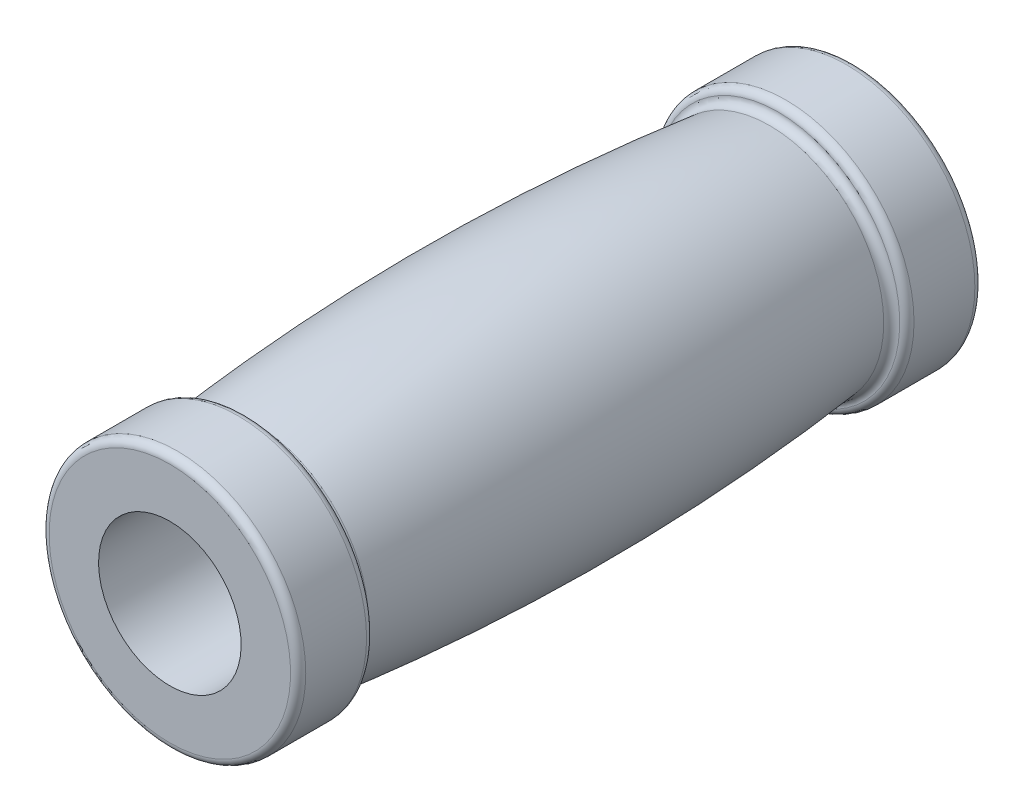
ISO-10303-21;
HEADER;
FILE_DESCRIPTION(('STEP AP214'),'2;1');
FILE_NAME('part.step','',(''),(''),'','','');
FILE_SCHEMA(('AUTOMOTIVE_DESIGN { 1 0 10303 214 1 1 1 1 }'));
ENDSEC;
DATA;
#1=APPLICATION_CONTEXT('core data for automotive mechanical design processes');
#2=APPLICATION_PROTOCOL_DEFINITION('international standard','automotive_design',2000,#1);
#3=PRODUCT_CONTEXT('',#1,'mechanical');
#4=PRODUCT('Part','Part','',(#3));
#5=PRODUCT_RELATED_PRODUCT_CATEGORY('part','',(#4));
#6=PRODUCT_DEFINITION_FORMATION('','',#4);
#7=PRODUCT_DEFINITION_CONTEXT('part definition',#1,'design');
#8=PRODUCT_DEFINITION('design','',#6,#7);
#9=PRODUCT_DEFINITION_SHAPE('','',#8);
#10=(LENGTH_UNIT() NAMED_UNIT(*) SI_UNIT(.MILLI.,.METRE.));
#11=(NAMED_UNIT(*) PLANE_ANGLE_UNIT() SI_UNIT($,.RADIAN.));
#12=(NAMED_UNIT(*) SI_UNIT($,.STERADIAN.) SOLID_ANGLE_UNIT());
#13=UNCERTAINTY_MEASURE_WITH_UNIT(LENGTH_MEASURE(1.E-05),#10,'distance_accuracy_value','');
#14=(GEOMETRIC_REPRESENTATION_CONTEXT(3) GLOBAL_UNCERTAINTY_ASSIGNED_CONTEXT((#13)) GLOBAL_UNIT_ASSIGNED_CONTEXT((#10,
#11,#12)) REPRESENTATION_CONTEXT('',''));
#15=CARTESIAN_POINT('',(0.,0.,0.));
#16=DIRECTION('',(0.,0.,1.));
#17=DIRECTION('',(1.,0.,0.));
#18=AXIS2_PLACEMENT_3D('',#15,#16,#17);
#19=CARTESIAN_POINT('',(0.,20.1612500000029,-57.15));
#20=DIRECTION('',(0.,0.,-1.));
#21=DIRECTION('',(0.,1.,0.));
#22=AXIS2_PLACEMENT_3D('',#19,#20,#21);
#23=PLANE('',#22);
#24=CARTESIAN_POINT('',(0.,0.,-57.1499999999967));
#25=DIRECTION('',(0.,0.,-1.));
#26=DIRECTION('',(0.,1.,0.));
#27=AXIS2_PLACEMENT_3D('',#24,#25,#26);
#28=CIRCLE('',#27,20.1612500000028);
#29=CARTESIAN_POINT('',(0.,20.1612500000029,-57.1499999999967));
#30=VERTEX_POINT('',#29);
#31=EDGE_CURVE('E10',#30,#30,#28,.T.);
#32=ORIENTED_EDGE('',*,*,#31,.T.);
#33=EDGE_LOOP('',(#32));
#34=FACE_BOUND('',#33,.T.);
#35=CARTESIAN_POINT('',(0.,0.,-57.1500000000033));
#36=DIRECTION('',(0.,0.,-1.));
#37=DIRECTION('',(0.,1.,0.));
#38=AXIS2_PLACEMENT_3D('',#35,#36,#37);
#39=CIRCLE('',#38,11.9062499999999);
#40=CARTESIAN_POINT('',(0.,11.90625,-57.1500000000033));
#41=VERTEX_POINT('',#40);
#42=EDGE_CURVE('E76',#41,#41,#39,.T.);
#43=ORIENTED_EDGE('',*,*,#42,.F.);
#44=EDGE_LOOP('',(#43));
#45=FACE_BOUND('',#44,.T.);
#46=ADVANCED_FACE('F30',(#34,#45),#23,.T.);
#47=CARTESIAN_POINT('',(0.,0.,-55.8799999999967));
#48=DIRECTION('',(0.,0.,-1.));
#49=DIRECTION('',(0.,1.,0.));
#50=AXIS2_PLACEMENT_3D('',#47,#48,#49);
#51=TOROIDAL_SURFACE('',#50,20.1612500000028,1.27);
#52=CARTESIAN_POINT('',(0.,0.,-55.8799999999967));
#53=DIRECTION('',(0.,0.,-1.));
#54=DIRECTION('',(0.,1.,0.));
#55=AXIS2_PLACEMENT_3D('',#52,#53,#54);
#56=CIRCLE('',#55,21.4312500000028);
#57=CARTESIAN_POINT('',(0.,21.4312500000029,-55.8799999999967));
#58=VERTEX_POINT('',#57);
#59=EDGE_CURVE('E36',#58,#58,#56,.T.);
#60=ORIENTED_EDGE('',*,*,#59,.T.);
#61=EDGE_LOOP('',(#60));
#62=FACE_BOUND('',#61,.T.);
#63=ORIENTED_EDGE('',*,*,#31,.F.);
#64=EDGE_LOOP('',(#63));
#65=FACE_BOUND('',#64,.T.);
#66=ADVANCED_FACE('F84',(#62,#65),#51,.T.);
#67=CARTESIAN_POINT('',(0.,0.,-57.1500000000033));
#68=DIRECTION('',(0.,0.,-1.));
#69=DIRECTION('',(0.,1.,0.));
#70=AXIS2_PLACEMENT_3D('',#67,#68,#69);
#71=CYLINDRICAL_SURFACE('',#70,21.4312500000014);
#72=CARTESIAN_POINT('',(0.,0.,-45.7199999999968));
#73=DIRECTION('',(0.,0.,-1.));
#74=DIRECTION('',(0.,1.,0.));
#75=AXIS2_PLACEMENT_3D('',#72,#73,#74);
#76=CIRCLE('',#75,21.4312499999999);
#77=CARTESIAN_POINT('',(0.,21.43125,-45.7199999999968));
#78=VERTEX_POINT('',#77);
#79=EDGE_CURVE('E40',#78,#78,#76,.T.);
#80=ORIENTED_EDGE('',*,*,#79,.T.);
#81=EDGE_LOOP('',(#80));
#82=FACE_BOUND('',#81,.T.);
#83=ORIENTED_EDGE('',*,*,#59,.F.);
#84=EDGE_LOOP('',(#83));
#85=FACE_BOUND('',#84,.T.);
#86=ADVANCED_FACE('F88',(#82,#85),#71,.T.);
#87=CARTESIAN_POINT('',(0.,0.,-45.7199999999968));
#88=DIRECTION('',(0.,0.,-1.));
#89=DIRECTION('',(0.,1.,0.));
#90=AXIS2_PLACEMENT_3D('',#87,#88,#89);
#91=TOROIDAL_SURFACE('',#90,20.1612499999999,1.27000000000006);
#92=CARTESIAN_POINT('',(0.,0.,-44.4499999999967));
#93=DIRECTION('',(0.,0.,-1.));
#94=DIRECTION('',(0.,1.,0.));
#95=AXIS2_PLACEMENT_3D('',#92,#93,#94);
#96=CIRCLE('',#95,20.1612499999999);
#97=CARTESIAN_POINT('',(0.,20.1612499999999,-44.4499999999967));
#98=VERTEX_POINT('',#97);
#99=EDGE_CURVE('E44',#98,#98,#96,.T.);
#100=ORIENTED_EDGE('',*,*,#99,.T.);
#101=EDGE_LOOP('',(#100));
#102=FACE_BOUND('',#101,.T.);
#103=ORIENTED_EDGE('',*,*,#79,.F.);
#104=EDGE_LOOP('',(#103));
#105=FACE_BOUND('',#104,.T.);
#106=ADVANCED_FACE('F92',(#102,#105),#91,.T.);
#107=CARTESIAN_POINT('',(0.,20.1612499999999,-44.4499999999967));
#108=DIRECTION('',(0.,0.,-1.));
#109=DIRECTION('',(0.,1.,0.));
#110=AXIS2_PLACEMENT_3D('',#107,#108,#109);
#111=PLANE('',#110);
#112=CARTESIAN_POINT('',(0.,0.,-44.4499999999967));
#113=DIRECTION('',(0.,0.,-1.));
#114=DIRECTION('',(0.,1.,0.));
#115=AXIS2_PLACEMENT_3D('',#112,#113,#114);
#116=CIRCLE('',#115,20.3122487124073);
#117=CARTESIAN_POINT('',(0.,20.3122487124074,-44.4499999999967));
#118=VERTEX_POINT('',#117);
#119=EDGE_CURVE('E49',#118,#118,#116,.T.);
#120=ORIENTED_EDGE('',*,*,#119,.T.);
#121=EDGE_LOOP('',(#120));
#122=FACE_BOUND('',#121,.T.);
#123=ORIENTED_EDGE('',*,*,#99,.F.);
#124=EDGE_LOOP('',(#123));
#125=FACE_BOUND('',#124,.T.);
#126=ADVANCED_FACE('F99',(#122,#125),#111,.T.);
#127=CARTESIAN_POINT('',(0.,0.,-43.1799999999967));
#128=DIRECTION('',(0.,0.,-1.));
#129=DIRECTION('',(0.,1.,0.));
#130=AXIS2_PLACEMENT_3D('',#127,#128,#129);
#131=TOROIDAL_SURFACE('',#130,20.3122487124073,1.27);
#132=CARTESIAN_POINT('',(0.,0.,-43.039899364646));
#133=DIRECTION('',(0.,0.,-1.));
#134=DIRECTION('',(0.,1.,0.));
#135=AXIS2_PLACEMENT_3D('',#132,#133,#134);
#136=CIRCLE('',#135,19.0500000000002);
#137=CARTESIAN_POINT('',(0.,19.0500000000002,-43.039899364646));
#138=VERTEX_POINT('',#137);
#139=EDGE_CURVE('E52',#138,#138,#136,.T.);
#140=ORIENTED_EDGE('',*,*,#139,.T.);
#141=EDGE_LOOP('',(#140));
#142=FACE_BOUND('',#141,.T.);
#143=ORIENTED_EDGE('',*,*,#119,.F.);
#144=EDGE_LOOP('',(#143));
#145=FACE_BOUND('',#144,.T.);
#146=ADVANCED_FACE('F103',(#142,#145),#131,.F.);
#147=CARTESIAN_POINT('',(0.,0.,-2.97306208634878E-12));
#148=DIRECTION('',(0.,0.,-1.));
#149=DIRECTION('',(0.,1.,0.));
#150=AXIS2_PLACEMENT_3D('',#147,#148,#149);
#151=DEGENERATE_TOROIDAL_SURFACE('',#150,368.721671549945,390.152921549944,.F.);
#152=CARTESIAN_POINT('',(0.,0.,43.0398993646459));
#153=DIRECTION('',(0.,0.,-1.));
#154=DIRECTION('',(0.,1.,0.));
#155=AXIS2_PLACEMENT_3D('',#152,#153,#154);
#156=CIRCLE('',#155,19.05);
#157=CARTESIAN_POINT('',(0.,19.0499999999999,43.0398993646459));
#158=VERTEX_POINT('',#157);
#159=EDGE_CURVE('E55',#158,#158,#156,.T.);
#160=ORIENTED_EDGE('',*,*,#159,.T.);
#161=EDGE_LOOP('',(#160));
#162=FACE_BOUND('',#161,.T.);
#163=ORIENTED_EDGE('',*,*,#139,.F.);
#164=EDGE_LOOP('',(#163));
#165=FACE_BOUND('',#164,.T.);
#166=ADVANCED_FACE('F107',(#162,#165),#151,.F.);
#167=CARTESIAN_POINT('',(0.,0.,43.1799999999966));
#168=DIRECTION('',(0.,0.,-1.));
#169=DIRECTION('',(0.,1.,0.));
#170=AXIS2_PLACEMENT_3D('',#167,#168,#169);
#171=TOROIDAL_SURFACE('',#170,20.3122487124074,1.27);
#172=CARTESIAN_POINT('',(0.,0.,44.4499999999966));
#173=DIRECTION('',(0.,0.,-1.));
#174=DIRECTION('',(0.,1.,0.));
#175=AXIS2_PLACEMENT_3D('',#172,#173,#174);
#176=CIRCLE('',#175,20.3122487124074);
#177=CARTESIAN_POINT('',(0.,20.3122487124074,44.4499999999967));
#178=VERTEX_POINT('',#177);
#179=EDGE_CURVE('E58',#178,#178,#176,.T.);
#180=ORIENTED_EDGE('',*,*,#179,.T.);
#181=EDGE_LOOP('',(#180));
#182=FACE_BOUND('',#181,.T.);
#183=ORIENTED_EDGE('',*,*,#159,.F.);
#184=EDGE_LOOP('',(#183));
#185=FACE_BOUND('',#184,.T.);
#186=ADVANCED_FACE('F111',(#182,#185),#171,.F.);
#187=CARTESIAN_POINT('',(0.,20.1612499999999,44.4499999999967));
#188=DIRECTION('',(0.,0.,1.));
#189=DIRECTION('',(0.,-1.,0.));
#190=AXIS2_PLACEMENT_3D('',#187,#188,#189);
#191=PLANE('',#190);
#192=CARTESIAN_POINT('',(0.,0.,44.4499999999967));
#193=DIRECTION('',(0.,0.,-1.));
#194=DIRECTION('',(0.,1.,0.));
#195=AXIS2_PLACEMENT_3D('',#192,#193,#194);
#196=CIRCLE('',#195,20.1612499999999);
#197=CARTESIAN_POINT('',(0.,20.1612499999999,44.4499999999967));
#198=VERTEX_POINT('',#197);
#199=EDGE_CURVE('E61',#198,#198,#196,.T.);
#200=ORIENTED_EDGE('',*,*,#199,.T.);
#201=EDGE_LOOP('',(#200));
#202=FACE_BOUND('',#201,.T.);
#203=ORIENTED_EDGE('',*,*,#179,.F.);
#204=EDGE_LOOP('',(#203));
#205=FACE_BOUND('',#204,.T.);
#206=ADVANCED_FACE('F115',(#202,#205),#191,.T.);
#207=CARTESIAN_POINT('',(0.,0.,45.7199999999968));
#208=DIRECTION('',(0.,0.,-1.));
#209=DIRECTION('',(0.,1.,0.));
#210=AXIS2_PLACEMENT_3D('',#207,#208,#209);
#211=TOROIDAL_SURFACE('',#210,20.1612499999999,1.27000000000006);
#212=CARTESIAN_POINT('',(0.,0.,45.7199999999968));
#213=DIRECTION('',(0.,0.,-1.));
#214=DIRECTION('',(0.,1.,0.));
#215=AXIS2_PLACEMENT_3D('',#212,#213,#214);
#216=CIRCLE('',#215,21.4312499999999);
#217=CARTESIAN_POINT('',(0.,21.4312499999999,45.7199999999968));
#218=VERTEX_POINT('',#217);
#219=EDGE_CURVE('E64',#218,#218,#216,.T.);
#220=ORIENTED_EDGE('',*,*,#219,.T.);
#221=EDGE_LOOP('',(#220));
#222=FACE_BOUND('',#221,.T.);
#223=ORIENTED_EDGE('',*,*,#199,.F.);
#224=EDGE_LOOP('',(#223));
#225=FACE_BOUND('',#224,.T.);
#226=ADVANCED_FACE('F119',(#222,#225),#211,.T.);
#227=CARTESIAN_POINT('',(0.,0.,-57.1500000000033));
#228=DIRECTION('',(0.,0.,-1.));
#229=DIRECTION('',(0.,1.,0.));
#230=AXIS2_PLACEMENT_3D('',#227,#228,#229);
#231=CYLINDRICAL_SURFACE('',#230,21.4312500000014);
#232=CARTESIAN_POINT('',(0.,0.,55.8799999999966));
#233=DIRECTION('',(0.,0.,-1.));
#234=DIRECTION('',(0.,1.,0.));
#235=AXIS2_PLACEMENT_3D('',#232,#233,#234);
#236=CIRCLE('',#235,21.4312500000029);
#237=CARTESIAN_POINT('',(0.,21.4312500000029,55.8799999999966));
#238=VERTEX_POINT('',#237);
#239=EDGE_CURVE('E67',#238,#238,#236,.T.);
#240=ORIENTED_EDGE('',*,*,#239,.T.);
#241=EDGE_LOOP('',(#240));
#242=FACE_BOUND('',#241,.T.);
#243=ORIENTED_EDGE('',*,*,#219,.F.);
#244=EDGE_LOOP('',(#243));
#245=FACE_BOUND('',#244,.T.);
#246=ADVANCED_FACE('F123',(#242,#245),#231,.T.);
#247=CARTESIAN_POINT('',(0.,0.,55.8799999999966));
#248=DIRECTION('',(0.,0.,-1.));
#249=DIRECTION('',(0.,1.,0.));
#250=AXIS2_PLACEMENT_3D('',#247,#248,#249);
#251=TOROIDAL_SURFACE('',#250,20.1612500000029,1.27);
#252=CARTESIAN_POINT('',(0.,0.,57.1499999999967));
#253=DIRECTION('',(0.,0.,-1.));
#254=DIRECTION('',(0.,1.,0.));
#255=AXIS2_PLACEMENT_3D('',#252,#253,#254);
#256=CIRCLE('',#255,20.1612500000029);
#257=CARTESIAN_POINT('',(0.,20.1612500000029,57.1499999999967));
#258=VERTEX_POINT('',#257);
#259=EDGE_CURVE('E70',#258,#258,#256,.T.);
#260=ORIENTED_EDGE('',*,*,#259,.T.);
#261=EDGE_LOOP('',(#260));
#262=FACE_BOUND('',#261,.T.);
#263=ORIENTED_EDGE('',*,*,#239,.F.);
#264=EDGE_LOOP('',(#263));
#265=FACE_BOUND('',#264,.T.);
#266=ADVANCED_FACE('F127',(#262,#265),#251,.T.);
#267=CARTESIAN_POINT('',(0.,20.1612500000029,57.1499999999967));
#268=DIRECTION('',(0.,0.,1.));
#269=DIRECTION('',(0.,-1.,0.));
#270=AXIS2_PLACEMENT_3D('',#267,#268,#269);
#271=PLANE('',#270);
#272=CARTESIAN_POINT('',(0.,0.,57.1499999999967));
#273=DIRECTION('',(0.,0.,-1.));
#274=DIRECTION('',(0.,1.,0.));
#275=AXIS2_PLACEMENT_3D('',#272,#273,#274);
#276=CIRCLE('',#275,11.90625);
#277=CARTESIAN_POINT('',(0.,11.90625,57.1499999999967));
#278=VERTEX_POINT('',#277);
#279=EDGE_CURVE('E73',#278,#278,#276,.T.);
#280=ORIENTED_EDGE('',*,*,#279,.T.);
#281=EDGE_LOOP('',(#280));
#282=FACE_BOUND('',#281,.T.);
#283=ORIENTED_EDGE('',*,*,#259,.F.);
#284=EDGE_LOOP('',(#283));
#285=FACE_BOUND('',#284,.T.);
#286=ADVANCED_FACE('F131',(#282,#285),#271,.T.);
#287=CARTESIAN_POINT('',(0.,0.,-57.1500000000033));
#288=DIRECTION('',(0.,0.,-1.));
#289=DIRECTION('',(0.,1.,0.));
#290=AXIS2_PLACEMENT_3D('',#287,#288,#289);
#291=CYLINDRICAL_SURFACE('',#290,11.90625);
#292=ORIENTED_EDGE('',*,*,#42,.T.);
#293=EDGE_LOOP('',(#292));
#294=FACE_BOUND('',#293,.T.);
#295=ORIENTED_EDGE('',*,*,#279,.F.);
#296=EDGE_LOOP('',(#295));
#297=FACE_BOUND('',#296,.T.);
#298=ADVANCED_FACE('F80',(#294,#297),#291,.F.);
#299=CLOSED_SHELL('',(#46,#66,#86,#106,#126,#146,#166,#186,#206,#226,#246,#266,#286,#298));
#300=MANIFOLD_SOLID_BREP('B2',#299);
#301=ADVANCED_BREP_SHAPE_REPRESENTATION('',(#18,#300),#14);
#302=SHAPE_DEFINITION_REPRESENTATION(#9,#301);
ENDSEC;
END-ISO-10303-21;
